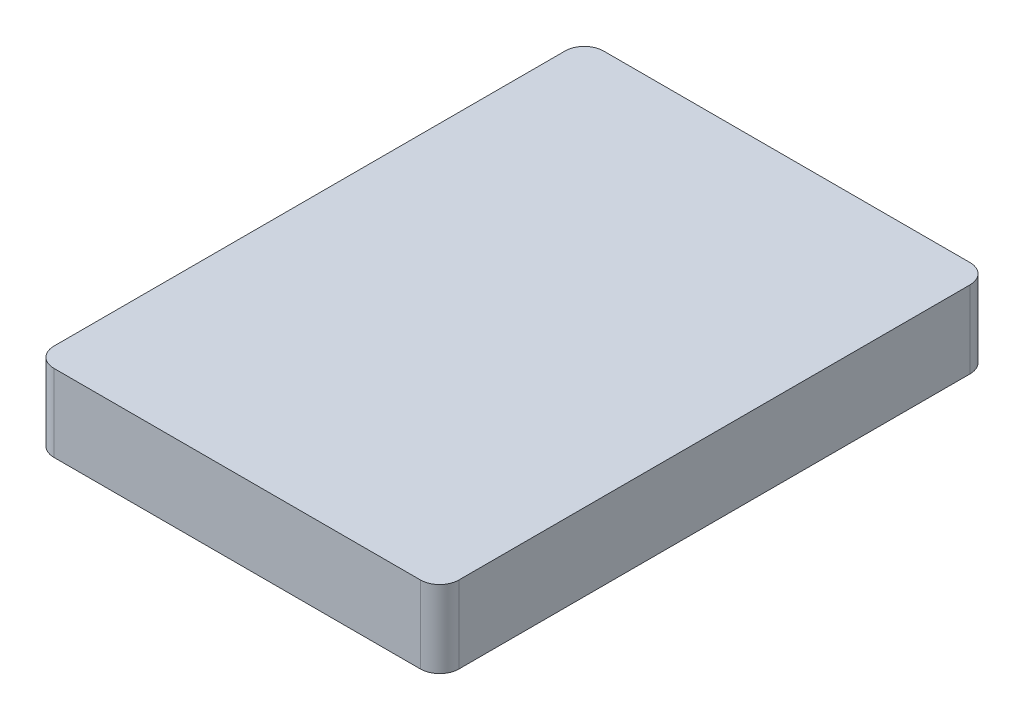
ISO-10303-21;
HEADER;
FILE_DESCRIPTION(('STEP AP214'),'2;1');
FILE_NAME('part.step','',(''),(''),'','','');
FILE_SCHEMA(('AUTOMOTIVE_DESIGN { 1 0 10303 214 1 1 1 1 }'));
ENDSEC;
DATA;
#1=APPLICATION_CONTEXT('core data for automotive mechanical design processes');
#2=APPLICATION_PROTOCOL_DEFINITION('international standard','automotive_design',2000,#1);
#3=PRODUCT_CONTEXT('',#1,'mechanical');
#4=PRODUCT('Part','Part','',(#3));
#5=PRODUCT_RELATED_PRODUCT_CATEGORY('part','',(#4));
#6=PRODUCT_DEFINITION_FORMATION('','',#4);
#7=PRODUCT_DEFINITION_CONTEXT('part definition',#1,'design');
#8=PRODUCT_DEFINITION('design','',#6,#7);
#9=PRODUCT_DEFINITION_SHAPE('','',#8);
#10=(LENGTH_UNIT() NAMED_UNIT(*) SI_UNIT(.MILLI.,.METRE.));
#11=(NAMED_UNIT(*) PLANE_ANGLE_UNIT() SI_UNIT($,.RADIAN.));
#12=(NAMED_UNIT(*) SI_UNIT($,.STERADIAN.) SOLID_ANGLE_UNIT());
#13=UNCERTAINTY_MEASURE_WITH_UNIT(LENGTH_MEASURE(1.E-05),#10,'distance_accuracy_value','');
#14=(GEOMETRIC_REPRESENTATION_CONTEXT(3) GLOBAL_UNCERTAINTY_ASSIGNED_CONTEXT((#13)) GLOBAL_UNIT_ASSIGNED_CONTEXT((#10,
#11,#12)) REPRESENTATION_CONTEXT('',''));
#15=CARTESIAN_POINT('',(0.,0.,0.));
#16=DIRECTION('',(0.,0.,1.));
#17=DIRECTION('',(1.,0.,0.));
#18=AXIS2_PLACEMENT_3D('',#15,#16,#17);
#19=CARTESIAN_POINT('',(0.,8.,0.));
#20=DIRECTION('',(1.,0.,0.));
#21=DIRECTION('',(0.,0.,-1.));
#22=AXIS2_PLACEMENT_3D('',#19,#20,#21);
#23=PLANE('',#22);
#24=DIRECTION('',(0.,0.,1.));
#25=VECTOR('',#24,1.);
#26=CARTESIAN_POINT('',(0.,8.,0.));
#27=LINE('',#26,#25);
#28=CARTESIAN_POINT('',(0.,8.,-55.));
#29=VERTEX_POINT('',#28);
#30=CARTESIAN_POINT('',(0.,8.,-2.));
#31=VERTEX_POINT('',#30);
#32=EDGE_CURVE('E118',#29,#31,#27,.T.);
#33=ORIENTED_EDGE('',*,*,#32,.F.);
#34=DIRECTION('',(0.,-1.,0.));
#35=VECTOR('',#34,1.);
#36=CARTESIAN_POINT('',(0.,8.,-55.));
#37=LINE('',#36,#35);
#38=CARTESIAN_POINT('',(0.,0.,-55.));
#39=VERTEX_POINT('',#38);
#40=EDGE_CURVE('E103',#29,#39,#37,.T.);
#41=ORIENTED_EDGE('',*,*,#40,.T.);
#42=DIRECTION('',(0.,0.,1.));
#43=VECTOR('',#42,1.);
#44=CARTESIAN_POINT('',(0.,0.,0.));
#45=LINE('',#44,#43);
#46=CARTESIAN_POINT('',(0.,0.,-2.));
#47=VERTEX_POINT('',#46);
#48=EDGE_CURVE('E115',#39,#47,#45,.T.);
#49=ORIENTED_EDGE('',*,*,#48,.T.);
#50=DIRECTION('',(0.,-1.,0.));
#51=VECTOR('',#50,1.);
#52=CARTESIAN_POINT('',(0.,8.,-2.));
#53=LINE('',#52,#51);
#54=EDGE_CURVE('E120',#47,#31,#53,.F.);
#55=ORIENTED_EDGE('',*,*,#54,.T.);
#56=EDGE_LOOP('',(#33,#41,#49,#55));
#57=FACE_BOUND('',#56,.T.);
#58=ADVANCED_FACE('F33',(#57),#23,.F.);
#59=CARTESIAN_POINT('',(0.,8.,0.));
#60=DIRECTION('',(0.,0.,-1.));
#61=DIRECTION('',(-1.,0.,0.));
#62=AXIS2_PLACEMENT_3D('',#59,#60,#61);
#63=PLANE('',#62);
#64=DIRECTION('',(1.,0.,0.));
#65=VECTOR('',#64,1.);
#66=CARTESIAN_POINT('',(0.,0.,0.));
#67=LINE('',#66,#65);
#68=CARTESIAN_POINT('',(2.,0.,0.));
#69=VERTEX_POINT('',#68);
#70=CARTESIAN_POINT('',(40.,0.,0.));
#71=VERTEX_POINT('',#70);
#72=EDGE_CURVE('E124',#69,#71,#67,.T.);
#73=ORIENTED_EDGE('',*,*,#72,.T.);
#74=DIRECTION('',(0.,-1.,0.));
#75=VECTOR('',#74,1.);
#76=CARTESIAN_POINT('',(40.,8.,0.));
#77=LINE('',#76,#75);
#78=CARTESIAN_POINT('',(40.,8.,0.));
#79=VERTEX_POINT('',#78);
#80=EDGE_CURVE('E11',#71,#79,#77,.F.);
#81=ORIENTED_EDGE('',*,*,#80,.T.);
#82=DIRECTION('',(1.,0.,0.));
#83=VECTOR('',#82,1.);
#84=CARTESIAN_POINT('',(0.,8.,0.));
#85=LINE('',#84,#83);
#86=CARTESIAN_POINT('',(2.,8.,0.));
#87=VERTEX_POINT('',#86);
#88=EDGE_CURVE('E160',#87,#79,#85,.T.);
#89=ORIENTED_EDGE('',*,*,#88,.F.);
#90=DIRECTION('',(0.,-1.,0.));
#91=VECTOR('',#90,1.);
#92=CARTESIAN_POINT('',(2.,8.,0.));
#93=LINE('',#92,#91);
#94=EDGE_CURVE('E41',#87,#69,#93,.T.);
#95=ORIENTED_EDGE('',*,*,#94,.T.);
#96=EDGE_LOOP('',(#73,#81,#89,#95));
#97=FACE_BOUND('',#96,.T.);
#98=ADVANCED_FACE('F158',(#97),#63,.F.);
#99=CARTESIAN_POINT('',(42.,8.,0.));
#100=DIRECTION('',(-1.,0.,0.));
#101=DIRECTION('',(0.,0.,1.));
#102=AXIS2_PLACEMENT_3D('',#99,#100,#101);
#103=PLANE('',#102);
#104=DIRECTION('',(0.,0.,-1.));
#105=VECTOR('',#104,1.);
#106=CARTESIAN_POINT('',(42.,0.,0.));
#107=LINE('',#106,#105);
#108=CARTESIAN_POINT('',(42.,0.,-2.));
#109=VERTEX_POINT('',#108);
#110=CARTESIAN_POINT('',(42.,0.,-55.));
#111=VERTEX_POINT('',#110);
#112=EDGE_CURVE('E127',#109,#111,#107,.T.);
#113=ORIENTED_EDGE('',*,*,#112,.T.);
#114=DIRECTION('',(0.,-1.,0.));
#115=VECTOR('',#114,1.);
#116=CARTESIAN_POINT('',(42.,8.,-55.));
#117=LINE('',#116,#115);
#118=CARTESIAN_POINT('',(42.,8.,-55.));
#119=VERTEX_POINT('',#118);
#120=EDGE_CURVE('E48',#111,#119,#117,.F.);
#121=ORIENTED_EDGE('',*,*,#120,.T.);
#122=DIRECTION('',(0.,0.,-1.));
#123=VECTOR('',#122,1.);
#124=CARTESIAN_POINT('',(42.,8.,0.));
#125=LINE('',#124,#123);
#126=CARTESIAN_POINT('',(42.,8.,-2.));
#127=VERTEX_POINT('',#126);
#128=EDGE_CURVE('E168',#127,#119,#125,.T.);
#129=ORIENTED_EDGE('',*,*,#128,.F.);
#130=DIRECTION('',(0.,-1.,0.));
#131=VECTOR('',#130,1.);
#132=CARTESIAN_POINT('',(42.,8.,-2.));
#133=LINE('',#132,#131);
#134=EDGE_CURVE('E151',#127,#109,#133,.T.);
#135=ORIENTED_EDGE('',*,*,#134,.T.);
#136=EDGE_LOOP('',(#113,#121,#129,#135));
#137=FACE_BOUND('',#136,.T.);
#138=ADVANCED_FACE('F167',(#137),#103,.F.);
#139=CARTESIAN_POINT('',(0.,8.,-57.));
#140=DIRECTION('',(0.,0.,1.));
#141=DIRECTION('',(1.,0.,0.));
#142=AXIS2_PLACEMENT_3D('',#139,#140,#141);
#143=PLANE('',#142);
#144=DIRECTION('',(-1.,0.,0.));
#145=VECTOR('',#144,1.);
#146=CARTESIAN_POINT('',(0.,0.,-57.));
#147=LINE('',#146,#145);
#148=CARTESIAN_POINT('',(40.,0.,-57.));
#149=VERTEX_POINT('',#148);
#150=CARTESIAN_POINT('',(2.,0.,-57.));
#151=VERTEX_POINT('',#150);
#152=EDGE_CURVE('E134',#149,#151,#147,.T.);
#153=ORIENTED_EDGE('',*,*,#152,.T.);
#154=DIRECTION('',(0.,-1.,0.));
#155=VECTOR('',#154,1.);
#156=CARTESIAN_POINT('',(2.,8.,-57.));
#157=LINE('',#156,#155);
#158=CARTESIAN_POINT('',(2.,8.,-57.));
#159=VERTEX_POINT('',#158);
#160=EDGE_CURVE('E104',#151,#159,#157,.F.);
#161=ORIENTED_EDGE('',*,*,#160,.T.);
#162=DIRECTION('',(-1.,0.,0.));
#163=VECTOR('',#162,1.);
#164=CARTESIAN_POINT('',(0.,8.,-57.));
#165=LINE('',#164,#163);
#166=CARTESIAN_POINT('',(40.,8.,-57.));
#167=VERTEX_POINT('',#166);
#168=EDGE_CURVE('E130',#167,#159,#165,.T.);
#169=ORIENTED_EDGE('',*,*,#168,.F.);
#170=DIRECTION('',(0.,-1.,0.));
#171=VECTOR('',#170,1.);
#172=CARTESIAN_POINT('',(40.,8.,-57.));
#173=LINE('',#172,#171);
#174=EDGE_CURVE('E109',#167,#149,#173,.T.);
#175=ORIENTED_EDGE('',*,*,#174,.T.);
#176=EDGE_LOOP('',(#153,#161,#169,#175));
#177=FACE_BOUND('',#176,.T.);
#178=ADVANCED_FACE('F196',(#177),#143,.F.);
#179=CARTESIAN_POINT('',(0.,8.,0.));
#180=DIRECTION('',(0.,-1.,0.));
#181=DIRECTION('',(0.,0.,-1.));
#182=AXIS2_PLACEMENT_3D('',#179,#180,#181);
#183=PLANE('',#182);
#184=ORIENTED_EDGE('',*,*,#168,.T.);
#185=CARTESIAN_POINT('',(2.,8.,-55.));
#186=DIRECTION('',(0.,-1.,0.));
#187=DIRECTION('',(0.,0.,-1.));
#188=AXIS2_PLACEMENT_3D('',#185,#186,#187);
#189=CIRCLE('',#188,2.);
#190=EDGE_CURVE('E149',#159,#29,#189,.F.);
#191=ORIENTED_EDGE('',*,*,#190,.T.);
#192=ORIENTED_EDGE('',*,*,#32,.T.);
#193=CARTESIAN_POINT('',(2.,8.,-2.));
#194=DIRECTION('',(0.,-1.,0.));
#195=DIRECTION('',(0.,0.,-1.));
#196=AXIS2_PLACEMENT_3D('',#193,#194,#195);
#197=CIRCLE('',#196,2.);
#198=EDGE_CURVE('E144',#31,#87,#197,.F.);
#199=ORIENTED_EDGE('',*,*,#198,.T.);
#200=ORIENTED_EDGE('',*,*,#88,.T.);
#201=CARTESIAN_POINT('',(40.,8.,-2.));
#202=DIRECTION('',(0.,-1.,0.));
#203=DIRECTION('',(0.,0.,-1.));
#204=AXIS2_PLACEMENT_3D('',#201,#202,#203);
#205=CIRCLE('',#204,2.);
#206=EDGE_CURVE('E55',#79,#127,#205,.F.);
#207=ORIENTED_EDGE('',*,*,#206,.T.);
#208=ORIENTED_EDGE('',*,*,#128,.T.);
#209=CARTESIAN_POINT('',(40.,8.,-55.));
#210=DIRECTION('',(0.,-1.,0.));
#211=DIRECTION('',(0.,0.,-1.));
#212=AXIS2_PLACEMENT_3D('',#209,#210,#211);
#213=CIRCLE('',#212,2.);
#214=EDGE_CURVE('E147',#119,#167,#213,.F.);
#215=ORIENTED_EDGE('',*,*,#214,.T.);
#216=EDGE_LOOP('',(#184,#191,#192,#199,#200,#207,#208,#215));
#217=FACE_BOUND('',#216,.T.);
#218=ADVANCED_FACE('F173',(#217),#183,.F.);
#219=CARTESIAN_POINT('',(0.,0.,0.));
#220=DIRECTION('',(0.,-1.,0.));
#221=DIRECTION('',(0.,0.,-1.));
#222=AXIS2_PLACEMENT_3D('',#219,#220,#221);
#223=PLANE('',#222);
#224=ORIENTED_EDGE('',*,*,#48,.F.);
#225=CARTESIAN_POINT('',(2.,0.,-55.));
#226=DIRECTION('',(0.,-1.,0.));
#227=DIRECTION('',(0.,0.,-1.));
#228=AXIS2_PLACEMENT_3D('',#225,#226,#227);
#229=CIRCLE('',#228,2.);
#230=EDGE_CURVE('E99',#39,#151,#229,.T.);
#231=ORIENTED_EDGE('',*,*,#230,.T.);
#232=ORIENTED_EDGE('',*,*,#152,.F.);
#233=CARTESIAN_POINT('',(40.,0.,-55.));
#234=DIRECTION('',(0.,-1.,0.));
#235=DIRECTION('',(0.,0.,-1.));
#236=AXIS2_PLACEMENT_3D('',#233,#234,#235);
#237=CIRCLE('',#236,2.);
#238=EDGE_CURVE('E110',#149,#111,#237,.T.);
#239=ORIENTED_EDGE('',*,*,#238,.T.);
#240=ORIENTED_EDGE('',*,*,#112,.F.);
#241=CARTESIAN_POINT('',(40.,0.,-2.));
#242=DIRECTION('',(0.,-1.,0.));
#243=DIRECTION('',(0.,0.,-1.));
#244=AXIS2_PLACEMENT_3D('',#241,#242,#243);
#245=CIRCLE('',#244,2.);
#246=EDGE_CURVE('E138',#109,#71,#245,.T.);
#247=ORIENTED_EDGE('',*,*,#246,.T.);
#248=ORIENTED_EDGE('',*,*,#72,.F.);
#249=CARTESIAN_POINT('',(2.,0.,-2.));
#250=DIRECTION('',(0.,-1.,0.));
#251=DIRECTION('',(0.,0.,-1.));
#252=AXIS2_PLACEMENT_3D('',#249,#250,#251);
#253=CIRCLE('',#252,2.);
#254=EDGE_CURVE('E119',#69,#47,#253,.T.);
#255=ORIENTED_EDGE('',*,*,#254,.T.);
#256=EDGE_LOOP('',(#224,#231,#232,#239,#240,#247,#248,#255));
#257=FACE_BOUND('',#256,.T.);
#258=ADVANCED_FACE('F122',(#257),#223,.T.);
#259=CARTESIAN_POINT('',(2.,8.,-55.));
#260=DIRECTION('',(0.,-1.,0.));
#261=DIRECTION('',(0.,0.,-1.));
#262=AXIS2_PLACEMENT_3D('',#259,#260,#261);
#263=CYLINDRICAL_SURFACE('',#262,2.);
#264=ORIENTED_EDGE('',*,*,#190,.F.);
#265=ORIENTED_EDGE('',*,*,#160,.F.);
#266=ORIENTED_EDGE('',*,*,#230,.F.);
#267=ORIENTED_EDGE('',*,*,#40,.F.);
#268=EDGE_LOOP('',(#264,#265,#266,#267));
#269=FACE_BOUND('',#268,.T.);
#270=ADVANCED_FACE('F102',(#269),#263,.T.);
#271=CARTESIAN_POINT('',(40.,8.,-55.));
#272=DIRECTION('',(0.,-1.,0.));
#273=DIRECTION('',(0.,0.,-1.));
#274=AXIS2_PLACEMENT_3D('',#271,#272,#273);
#275=CYLINDRICAL_SURFACE('',#274,2.);
#276=ORIENTED_EDGE('',*,*,#214,.F.);
#277=ORIENTED_EDGE('',*,*,#120,.F.);
#278=ORIENTED_EDGE('',*,*,#238,.F.);
#279=ORIENTED_EDGE('',*,*,#174,.F.);
#280=EDGE_LOOP('',(#276,#277,#278,#279));
#281=FACE_BOUND('',#280,.T.);
#282=ADVANCED_FACE('F178',(#281),#275,.T.);
#283=CARTESIAN_POINT('',(40.,8.,-2.));
#284=DIRECTION('',(0.,-1.,0.));
#285=DIRECTION('',(0.,0.,-1.));
#286=AXIS2_PLACEMENT_3D('',#283,#284,#285);
#287=CYLINDRICAL_SURFACE('',#286,2.);
#288=ORIENTED_EDGE('',*,*,#206,.F.);
#289=ORIENTED_EDGE('',*,*,#80,.F.);
#290=ORIENTED_EDGE('',*,*,#246,.F.);
#291=ORIENTED_EDGE('',*,*,#134,.F.);
#292=EDGE_LOOP('',(#288,#289,#290,#291));
#293=FACE_BOUND('',#292,.T.);
#294=ADVANCED_FACE('F166',(#293),#287,.T.);
#295=CARTESIAN_POINT('',(2.,8.,-2.));
#296=DIRECTION('',(0.,-1.,0.));
#297=DIRECTION('',(0.,0.,-1.));
#298=AXIS2_PLACEMENT_3D('',#295,#296,#297);
#299=CYLINDRICAL_SURFACE('',#298,2.);
#300=ORIENTED_EDGE('',*,*,#198,.F.);
#301=ORIENTED_EDGE('',*,*,#54,.F.);
#302=ORIENTED_EDGE('',*,*,#254,.F.);
#303=ORIENTED_EDGE('',*,*,#94,.F.);
#304=EDGE_LOOP('',(#300,#301,#302,#303));
#305=FACE_BOUND('',#304,.T.);
#306=ADVANCED_FACE('F35',(#305),#299,.T.);
#307=CLOSED_SHELL('',(#58,#98,#138,#178,#218,#258,#270,#282,#294,#306));
#308=MANIFOLD_SOLID_BREP('B2',#307);
#309=ADVANCED_BREP_SHAPE_REPRESENTATION('',(#18,#308),#14);
#310=SHAPE_DEFINITION_REPRESENTATION(#9,#309);
ENDSEC;
END-ISO-10303-21;
